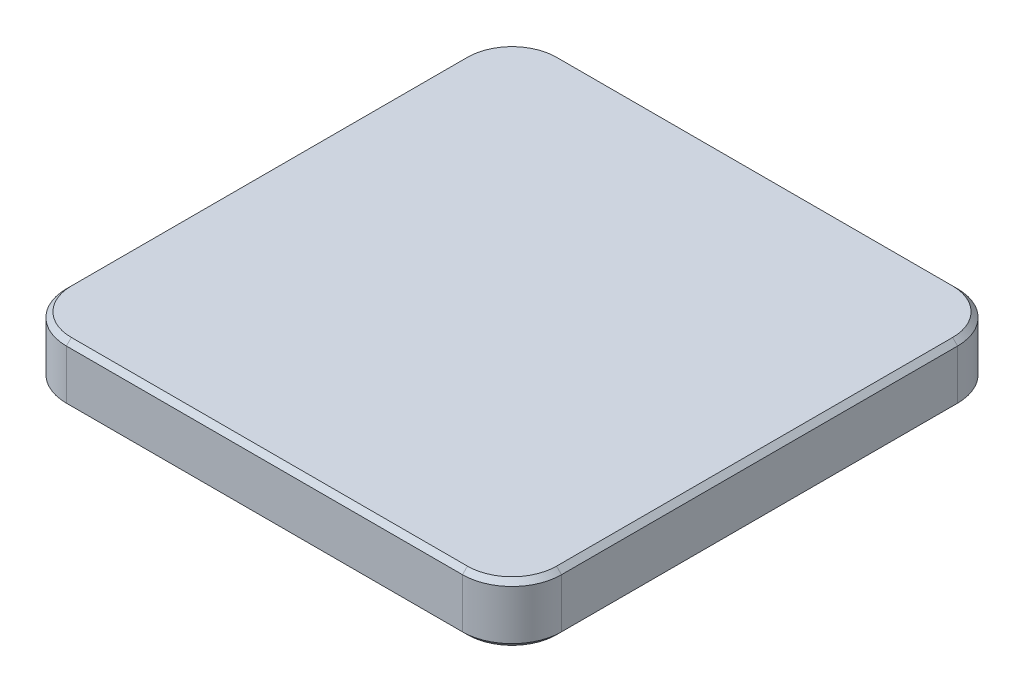
ISO-10303-21;
HEADER;
FILE_DESCRIPTION(('STEP AP214'),'2;1');
FILE_NAME('part.step','',(''),(''),'','','');
FILE_SCHEMA(('AUTOMOTIVE_DESIGN { 1 0 10303 214 1 1 1 1 }'));
ENDSEC;
DATA;
#1=APPLICATION_CONTEXT('core data for automotive mechanical design processes');
#2=APPLICATION_PROTOCOL_DEFINITION('international standard','automotive_design',2000,#1);
#3=PRODUCT_CONTEXT('',#1,'mechanical');
#4=PRODUCT('Part','Part','',(#3));
#5=PRODUCT_RELATED_PRODUCT_CATEGORY('part','',(#4));
#6=PRODUCT_DEFINITION_FORMATION('','',#4);
#7=PRODUCT_DEFINITION_CONTEXT('part definition',#1,'design');
#8=PRODUCT_DEFINITION('design','',#6,#7);
#9=PRODUCT_DEFINITION_SHAPE('','',#8);
#10=(LENGTH_UNIT() NAMED_UNIT(*) SI_UNIT(.MILLI.,.METRE.));
#11=(NAMED_UNIT(*) PLANE_ANGLE_UNIT() SI_UNIT($,.RADIAN.));
#12=(NAMED_UNIT(*) SI_UNIT($,.STERADIAN.) SOLID_ANGLE_UNIT());
#13=UNCERTAINTY_MEASURE_WITH_UNIT(LENGTH_MEASURE(1.E-05),#10,'distance_accuracy_value','');
#14=(GEOMETRIC_REPRESENTATION_CONTEXT(3) GLOBAL_UNCERTAINTY_ASSIGNED_CONTEXT((#13)) GLOBAL_UNIT_ASSIGNED_CONTEXT((#10,
#11,#12)) REPRESENTATION_CONTEXT('',''));
#15=CARTESIAN_POINT('',(0.,0.,0.));
#16=DIRECTION('',(0.,0.,1.));
#17=DIRECTION('',(1.,0.,0.));
#18=AXIS2_PLACEMENT_3D('',#15,#16,#17);
#19=CARTESIAN_POINT('',(-40.,6.,40.));
#20=DIRECTION('',(0.,-1.,0.));
#21=DIRECTION('',(0.,0.,-1.));
#22=AXIS2_PLACEMENT_3D('',#19,#20,#21);
#23=CYLINDRICAL_SURFACE('',#22,10.);
#24=DIRECTION('',(0.,-1.,0.));
#25=VECTOR('',#24,1.);
#26=CARTESIAN_POINT('',(-50.,6.,39.9999999999999));
#27=LINE('',#26,#25);
#28=CARTESIAN_POINT('',(-50.,5.,39.9999999999999));
#29=VERTEX_POINT('',#28);
#30=CARTESIAN_POINT('',(-50.,-5.00000000000003,39.9999999999999));
#31=VERTEX_POINT('',#30);
#32=EDGE_CURVE('E274',#29,#31,#27,.T.);
#33=ORIENTED_EDGE('',*,*,#32,.T.);
#34=CARTESIAN_POINT('',(-40.,-5.00000000000003,40.));
#35=DIRECTION('',(0.,-1.,0.));
#36=DIRECTION('',(0.,0.,-1.));
#37=AXIS2_PLACEMENT_3D('',#34,#35,#36);
#38=CIRCLE('',#37,10.);
#39=CARTESIAN_POINT('',(-39.9999999999999,-5.00000000000003,50.));
#40=VERTEX_POINT('',#39);
#41=EDGE_CURVE('E239',#31,#40,#38,.F.);
#42=ORIENTED_EDGE('',*,*,#41,.T.);
#43=DIRECTION('',(0.,-1.,0.));
#44=VECTOR('',#43,1.);
#45=CARTESIAN_POINT('',(-39.9999999999999,6.,50.));
#46=LINE('',#45,#44);
#47=CARTESIAN_POINT('',(-39.9999999999999,5.,50.));
#48=VERTEX_POINT('',#47);
#49=EDGE_CURVE('E178',#48,#40,#46,.T.);
#50=ORIENTED_EDGE('',*,*,#49,.F.);
#51=CARTESIAN_POINT('',(-40.,5.,40.));
#52=DIRECTION('',(0.,-1.,0.));
#53=DIRECTION('',(0.,0.,-1.));
#54=AXIS2_PLACEMENT_3D('',#51,#52,#53);
#55=CIRCLE('',#54,10.);
#56=EDGE_CURVE('E237',#48,#29,#55,.T.);
#57=ORIENTED_EDGE('',*,*,#56,.T.);
#58=EDGE_LOOP('',(#33,#42,#50,#57));
#59=FACE_BOUND('',#58,.T.);
#60=ADVANCED_FACE('F41',(#59),#23,.T.);
#61=CARTESIAN_POINT('',(-39.9999999999999,6.,50.));
#62=DIRECTION('',(0.,0.,-1.));
#63=DIRECTION('',(-1.,0.,0.));
#64=AXIS2_PLACEMENT_3D('',#61,#62,#63);
#65=PLANE('',#64);
#66=ORIENTED_EDGE('',*,*,#49,.T.);
#67=DIRECTION('',(1.,0.,0.));
#68=VECTOR('',#67,1.);
#69=CARTESIAN_POINT('',(39.9999999999999,-5.00000000000003,50.));
#70=LINE('',#69,#68);
#71=CARTESIAN_POINT('',(39.9999999999999,-5.00000000000003,50.));
#72=VERTEX_POINT('',#71);
#73=EDGE_CURVE('E177',#40,#72,#70,.T.);
#74=ORIENTED_EDGE('',*,*,#73,.T.);
#75=DIRECTION('',(0.,-1.,0.));
#76=VECTOR('',#75,1.);
#77=CARTESIAN_POINT('',(39.9999999999999,6.,50.));
#78=LINE('',#77,#76);
#79=CARTESIAN_POINT('',(39.9999999999999,5.,50.));
#80=VERTEX_POINT('',#79);
#81=EDGE_CURVE('E159',#80,#72,#78,.T.);
#82=ORIENTED_EDGE('',*,*,#81,.F.);
#83=DIRECTION('',(-1.,0.,0.));
#84=VECTOR('',#83,1.);
#85=CARTESIAN_POINT('',(-39.9999999999999,5.,50.));
#86=LINE('',#85,#84);
#87=EDGE_CURVE('E174',#80,#48,#86,.T.);
#88=ORIENTED_EDGE('',*,*,#87,.T.);
#89=EDGE_LOOP('',(#66,#74,#82,#88));
#90=FACE_BOUND('',#89,.T.);
#91=ADVANCED_FACE('F172',(#90),#65,.F.);
#92=CARTESIAN_POINT('',(40.,6.,40.));
#93=DIRECTION('',(0.,-1.,0.));
#94=DIRECTION('',(0.,0.,-1.));
#95=AXIS2_PLACEMENT_3D('',#92,#93,#94);
#96=CYLINDRICAL_SURFACE('',#95,10.);
#97=ORIENTED_EDGE('',*,*,#81,.T.);
#98=CARTESIAN_POINT('',(40.,-5.00000000000003,40.));
#99=DIRECTION('',(0.,-1.,0.));
#100=DIRECTION('',(0.,0.,-1.));
#101=AXIS2_PLACEMENT_3D('',#98,#99,#100);
#102=CIRCLE('',#101,10.);
#103=CARTESIAN_POINT('',(50.,-5.00000000000003,39.9999999999999));
#104=VERTEX_POINT('',#103);
#105=EDGE_CURVE('E166',#72,#104,#102,.F.);
#106=ORIENTED_EDGE('',*,*,#105,.T.);
#107=DIRECTION('',(0.,-1.,0.));
#108=VECTOR('',#107,1.);
#109=CARTESIAN_POINT('',(50.,6.,39.9999999999999));
#110=LINE('',#109,#108);
#111=CARTESIAN_POINT('',(50.,5.,39.9999999999999));
#112=VERTEX_POINT('',#111);
#113=EDGE_CURVE('E161',#112,#104,#110,.T.);
#114=ORIENTED_EDGE('',*,*,#113,.F.);
#115=CARTESIAN_POINT('',(40.,5.,40.));
#116=DIRECTION('',(0.,-1.,0.));
#117=DIRECTION('',(0.,0.,-1.));
#118=AXIS2_PLACEMENT_3D('',#115,#116,#117);
#119=CIRCLE('',#118,10.);
#120=EDGE_CURVE('E156',#112,#80,#119,.T.);
#121=ORIENTED_EDGE('',*,*,#120,.T.);
#122=EDGE_LOOP('',(#97,#106,#114,#121));
#123=FACE_BOUND('',#122,.T.);
#124=ADVANCED_FACE('F158',(#123),#96,.T.);
#125=CARTESIAN_POINT('',(50.,6.,39.9999999999999));
#126=DIRECTION('',(-1.,0.,0.));
#127=DIRECTION('',(0.,0.,1.));
#128=AXIS2_PLACEMENT_3D('',#125,#126,#127);
#129=PLANE('',#128);
#130=ORIENTED_EDGE('',*,*,#113,.T.);
#131=DIRECTION('',(0.,0.,-1.));
#132=VECTOR('',#131,1.);
#133=CARTESIAN_POINT('',(50.,-5.00000000000003,-39.9999999999999));
#134=LINE('',#133,#132);
#135=CARTESIAN_POINT('',(50.,-5.00000000000003,-39.9999999999999));
#136=VERTEX_POINT('',#135);
#137=EDGE_CURVE('E218',#104,#136,#134,.T.);
#138=ORIENTED_EDGE('',*,*,#137,.T.);
#139=DIRECTION('',(0.,-1.,0.));
#140=VECTOR('',#139,1.);
#141=CARTESIAN_POINT('',(50.,6.,-39.9999999999999));
#142=LINE('',#141,#140);
#143=CARTESIAN_POINT('',(50.,5.,-39.9999999999999));
#144=VERTEX_POINT('',#143);
#145=EDGE_CURVE('E299',#144,#136,#142,.T.);
#146=ORIENTED_EDGE('',*,*,#145,.F.);
#147=DIRECTION('',(0.,0.,1.));
#148=VECTOR('',#147,1.);
#149=CARTESIAN_POINT('',(50.,5.,39.9999999999999));
#150=LINE('',#149,#148);
#151=EDGE_CURVE('E216',#144,#112,#150,.T.);
#152=ORIENTED_EDGE('',*,*,#151,.T.);
#153=EDGE_LOOP('',(#130,#138,#146,#152));
#154=FACE_BOUND('',#153,.T.);
#155=ADVANCED_FACE('F296',(#154),#129,.F.);
#156=CARTESIAN_POINT('',(40.,6.,-40.));
#157=DIRECTION('',(0.,-1.,0.));
#158=DIRECTION('',(0.,0.,-1.));
#159=AXIS2_PLACEMENT_3D('',#156,#157,#158);
#160=CYLINDRICAL_SURFACE('',#159,10.);
#161=ORIENTED_EDGE('',*,*,#145,.T.);
#162=CARTESIAN_POINT('',(40.,-5.00000000000003,-40.));
#163=DIRECTION('',(0.,-1.,0.));
#164=DIRECTION('',(0.,0.,-1.));
#165=AXIS2_PLACEMENT_3D('',#162,#163,#164);
#166=CIRCLE('',#165,10.);
#167=CARTESIAN_POINT('',(39.9999999999999,-5.00000000000003,-50.));
#168=VERTEX_POINT('',#167);
#169=EDGE_CURVE('E222',#136,#168,#166,.F.);
#170=ORIENTED_EDGE('',*,*,#169,.T.);
#171=DIRECTION('',(0.,-1.,0.));
#172=VECTOR('',#171,1.);
#173=CARTESIAN_POINT('',(39.9999999999999,6.,-50.));
#174=LINE('',#173,#172);
#175=CARTESIAN_POINT('',(39.9999999999999,5.,-50.));
#176=VERTEX_POINT('',#175);
#177=EDGE_CURVE('E302',#176,#168,#174,.T.);
#178=ORIENTED_EDGE('',*,*,#177,.F.);
#179=CARTESIAN_POINT('',(40.,5.,-40.));
#180=DIRECTION('',(0.,-1.,0.));
#181=DIRECTION('',(0.,0.,-1.));
#182=AXIS2_PLACEMENT_3D('',#179,#180,#181);
#183=CIRCLE('',#182,10.);
#184=EDGE_CURVE('E220',#176,#144,#183,.T.);
#185=ORIENTED_EDGE('',*,*,#184,.T.);
#186=EDGE_LOOP('',(#161,#170,#178,#185));
#187=FACE_BOUND('',#186,.T.);
#188=ADVANCED_FACE('F347',(#187),#160,.T.);
#189=CARTESIAN_POINT('',(-39.9999999999999,6.,-50.));
#190=DIRECTION('',(0.,0.,1.));
#191=DIRECTION('',(1.,0.,0.));
#192=AXIS2_PLACEMENT_3D('',#189,#190,#191);
#193=PLANE('',#192);
#194=ORIENTED_EDGE('',*,*,#177,.T.);
#195=DIRECTION('',(-1.,0.,0.));
#196=VECTOR('',#195,1.);
#197=CARTESIAN_POINT('',(-39.9999999999999,-5.00000000000003,-50.));
#198=LINE('',#197,#196);
#199=CARTESIAN_POINT('',(-39.9999999999999,-5.00000000000003,-50.));
#200=VERTEX_POINT('',#199);
#201=EDGE_CURVE('E226',#168,#200,#198,.T.);
#202=ORIENTED_EDGE('',*,*,#201,.T.);
#203=DIRECTION('',(0.,-1.,0.));
#204=VECTOR('',#203,1.);
#205=CARTESIAN_POINT('',(-39.9999999999999,6.,-50.));
#206=LINE('',#205,#204);
#207=CARTESIAN_POINT('',(-39.9999999999999,5.,-50.));
#208=VERTEX_POINT('',#207);
#209=EDGE_CURVE('E306',#208,#200,#206,.T.);
#210=ORIENTED_EDGE('',*,*,#209,.F.);
#211=DIRECTION('',(1.,0.,0.));
#212=VECTOR('',#211,1.);
#213=CARTESIAN_POINT('',(-39.9999999999999,5.,-50.));
#214=LINE('',#213,#212);
#215=EDGE_CURVE('E224',#208,#176,#214,.T.);
#216=ORIENTED_EDGE('',*,*,#215,.T.);
#217=EDGE_LOOP('',(#194,#202,#210,#216));
#218=FACE_BOUND('',#217,.T.);
#219=ADVANCED_FACE('F350',(#218),#193,.F.);
#220=CARTESIAN_POINT('',(-40.,6.,-40.));
#221=DIRECTION('',(0.,-1.,0.));
#222=DIRECTION('',(0.,0.,-1.));
#223=AXIS2_PLACEMENT_3D('',#220,#221,#222);
#224=CYLINDRICAL_SURFACE('',#223,10.);
#225=ORIENTED_EDGE('',*,*,#209,.T.);
#226=CARTESIAN_POINT('',(-40.,-5.00000000000003,-40.));
#227=DIRECTION('',(0.,-1.,0.));
#228=DIRECTION('',(0.,0.,-1.));
#229=AXIS2_PLACEMENT_3D('',#226,#227,#228);
#230=CIRCLE('',#229,10.);
#231=CARTESIAN_POINT('',(-50.,-5.00000000000003,-39.9999999999999));
#232=VERTEX_POINT('',#231);
#233=EDGE_CURVE('E230',#200,#232,#230,.F.);
#234=ORIENTED_EDGE('',*,*,#233,.T.);
#235=DIRECTION('',(0.,-1.,0.));
#236=VECTOR('',#235,1.);
#237=CARTESIAN_POINT('',(-50.,6.,-39.9999999999999));
#238=LINE('',#237,#236);
#239=CARTESIAN_POINT('',(-50.,5.,-39.9999999999999));
#240=VERTEX_POINT('',#239);
#241=EDGE_CURVE('E311',#240,#232,#238,.T.);
#242=ORIENTED_EDGE('',*,*,#241,.F.);
#243=CARTESIAN_POINT('',(-40.,5.,-40.));
#244=DIRECTION('',(0.,-1.,0.));
#245=DIRECTION('',(0.,0.,-1.));
#246=AXIS2_PLACEMENT_3D('',#243,#244,#245);
#247=CIRCLE('',#246,10.);
#248=EDGE_CURVE('E228',#240,#208,#247,.T.);
#249=ORIENTED_EDGE('',*,*,#248,.T.);
#250=EDGE_LOOP('',(#225,#234,#242,#249));
#251=FACE_BOUND('',#250,.T.);
#252=ADVANCED_FACE('F364',(#251),#224,.T.);
#253=CARTESIAN_POINT('',(-50.,6.,39.9999999999999));
#254=DIRECTION('',(1.,0.,0.));
#255=DIRECTION('',(0.,0.,-1.));
#256=AXIS2_PLACEMENT_3D('',#253,#254,#255);
#257=PLANE('',#256);
#258=ORIENTED_EDGE('',*,*,#241,.T.);
#259=DIRECTION('',(0.,0.,1.));
#260=VECTOR('',#259,1.);
#261=CARTESIAN_POINT('',(-50.,-5.00000000000003,39.9999999999999));
#262=LINE('',#261,#260);
#263=EDGE_CURVE('E235',#232,#31,#262,.T.);
#264=ORIENTED_EDGE('',*,*,#263,.T.);
#265=ORIENTED_EDGE('',*,*,#32,.F.);
#266=DIRECTION('',(0.,0.,-1.));
#267=VECTOR('',#266,1.);
#268=CARTESIAN_POINT('',(-50.,5.,39.9999999999999));
#269=LINE('',#268,#267);
#270=EDGE_CURVE('E232',#29,#240,#269,.T.);
#271=ORIENTED_EDGE('',*,*,#270,.T.);
#272=EDGE_LOOP('',(#258,#264,#265,#271));
#273=FACE_BOUND('',#272,.T.);
#274=ADVANCED_FACE('F365',(#273),#257,.F.);
#275=CARTESIAN_POINT('',(-40.,6.,40.));
#276=DIRECTION('',(0.,-1.,0.));
#277=DIRECTION('',(0.,0.,-1.));
#278=AXIS2_PLACEMENT_3D('',#275,#276,#277);
#279=PLANE('',#278);
#280=CARTESIAN_POINT('',(-40.,6.,-40.));
#281=DIRECTION('',(0.,-1.,0.));
#282=DIRECTION('',(0.,0.,-1.));
#283=AXIS2_PLACEMENT_3D('',#280,#281,#282);
#284=CIRCLE('',#283,9.00000000000001);
#285=CARTESIAN_POINT('',(-39.9999999999999,6.,-49.));
#286=VERTEX_POINT('',#285);
#287=CARTESIAN_POINT('',(-49.,6.,-39.9999999999999));
#288=VERTEX_POINT('',#287);
#289=EDGE_CURVE('E51',#286,#288,#284,.F.);
#290=ORIENTED_EDGE('',*,*,#289,.T.);
#291=DIRECTION('',(0.,0.,1.));
#292=VECTOR('',#291,1.);
#293=CARTESIAN_POINT('',(-49.,6.,40.));
#294=LINE('',#293,#292);
#295=CARTESIAN_POINT('',(-49.,6.,39.9999999999999));
#296=VERTEX_POINT('',#295);
#297=EDGE_CURVE('E11',#288,#296,#294,.T.);
#298=ORIENTED_EDGE('',*,*,#297,.T.);
#299=CARTESIAN_POINT('',(-40.,6.,40.));
#300=DIRECTION('',(0.,-1.,0.));
#301=DIRECTION('',(0.,0.,-1.));
#302=AXIS2_PLACEMENT_3D('',#299,#300,#301);
#303=CIRCLE('',#302,9.00000000000001);
#304=CARTESIAN_POINT('',(-39.9999999999999,6.,49.));
#305=VERTEX_POINT('',#304);
#306=EDGE_CURVE('E241',#296,#305,#303,.F.);
#307=ORIENTED_EDGE('',*,*,#306,.T.);
#308=DIRECTION('',(1.,0.,0.));
#309=VECTOR('',#308,1.);
#310=CARTESIAN_POINT('',(-40.,6.,49.));
#311=LINE('',#310,#309);
#312=CARTESIAN_POINT('',(39.9999999999999,6.,49.));
#313=VERTEX_POINT('',#312);
#314=EDGE_CURVE('E243',#305,#313,#311,.T.);
#315=ORIENTED_EDGE('',*,*,#314,.T.);
#316=CARTESIAN_POINT('',(40.,6.,40.));
#317=DIRECTION('',(0.,-1.,0.));
#318=DIRECTION('',(0.,0.,-1.));
#319=AXIS2_PLACEMENT_3D('',#316,#317,#318);
#320=CIRCLE('',#319,9.00000000000001);
#321=CARTESIAN_POINT('',(49.,6.,39.9999999999999));
#322=VERTEX_POINT('',#321);
#323=EDGE_CURVE('E184',#313,#322,#320,.F.);
#324=ORIENTED_EDGE('',*,*,#323,.T.);
#325=DIRECTION('',(0.,0.,-1.));
#326=VECTOR('',#325,1.);
#327=CARTESIAN_POINT('',(49.,6.,40.));
#328=LINE('',#327,#326);
#329=CARTESIAN_POINT('',(49.,6.,-39.9999999999999));
#330=VERTEX_POINT('',#329);
#331=EDGE_CURVE('E246',#322,#330,#328,.T.);
#332=ORIENTED_EDGE('',*,*,#331,.T.);
#333=CARTESIAN_POINT('',(40.,6.,-40.));
#334=DIRECTION('',(0.,-1.,0.));
#335=DIRECTION('',(0.,0.,-1.));
#336=AXIS2_PLACEMENT_3D('',#333,#334,#335);
#337=CIRCLE('',#336,9.00000000000001);
#338=CARTESIAN_POINT('',(39.9999999999999,6.,-49.));
#339=VERTEX_POINT('',#338);
#340=EDGE_CURVE('E248',#330,#339,#337,.F.);
#341=ORIENTED_EDGE('',*,*,#340,.T.);
#342=DIRECTION('',(-1.,0.,0.));
#343=VECTOR('',#342,1.);
#344=CARTESIAN_POINT('',(-40.,6.,-49.));
#345=LINE('',#344,#343);
#346=EDGE_CURVE('E62',#339,#286,#345,.T.);
#347=ORIENTED_EDGE('',*,*,#346,.T.);
#348=EDGE_LOOP('',(#290,#298,#307,#315,#324,#332,#341,#347));
#349=FACE_BOUND('',#348,.T.);
#350=ADVANCED_FACE('F374',(#349),#279,.F.);
#351=CARTESIAN_POINT('',(-40.,-6.,40.));
#352=DIRECTION('',(0.,-1.,0.));
#353=DIRECTION('',(0.,0.,-1.));
#354=AXIS2_PLACEMENT_3D('',#351,#352,#353);
#355=PLANE('',#354);
#356=CARTESIAN_POINT('',(40.,-6.,40.));
#357=DIRECTION('',(0.,-1.,0.));
#358=DIRECTION('',(0.,0.,-1.));
#359=AXIS2_PLACEMENT_3D('',#356,#357,#358);
#360=CIRCLE('',#359,9.00000000000002);
#361=CARTESIAN_POINT('',(49.,-6.,39.9999999999999));
#362=VERTEX_POINT('',#361);
#363=CARTESIAN_POINT('',(39.9999999999999,-6.,49.));
#364=VERTEX_POINT('',#363);
#365=EDGE_CURVE('E211',#362,#364,#360,.T.);
#366=ORIENTED_EDGE('',*,*,#365,.T.);
#367=DIRECTION('',(-1.,0.,0.));
#368=VECTOR('',#367,1.);
#369=CARTESIAN_POINT('',(-39.9999999999999,-6.,49.));
#370=LINE('',#369,#368);
#371=CARTESIAN_POINT('',(-39.9999999999999,-6.,49.));
#372=VERTEX_POINT('',#371);
#373=EDGE_CURVE('E167',#364,#372,#370,.T.);
#374=ORIENTED_EDGE('',*,*,#373,.T.);
#375=CARTESIAN_POINT('',(-40.,-6.,40.));
#376=DIRECTION('',(0.,-1.,0.));
#377=DIRECTION('',(0.,0.,-1.));
#378=AXIS2_PLACEMENT_3D('',#375,#376,#377);
#379=CIRCLE('',#378,9.00000000000002);
#380=CARTESIAN_POINT('',(-49.,-6.,39.9999999999999));
#381=VERTEX_POINT('',#380);
#382=EDGE_CURVE('E196',#372,#381,#379,.T.);
#383=ORIENTED_EDGE('',*,*,#382,.T.);
#384=DIRECTION('',(0.,0.,-1.));
#385=VECTOR('',#384,1.);
#386=CARTESIAN_POINT('',(-49.,-6.,-39.9999999999999));
#387=LINE('',#386,#385);
#388=CARTESIAN_POINT('',(-49.,-6.,-39.9999999999999));
#389=VERTEX_POINT('',#388);
#390=EDGE_CURVE('E201',#381,#389,#387,.T.);
#391=ORIENTED_EDGE('',*,*,#390,.T.);
#392=CARTESIAN_POINT('',(-40.,-6.,-40.));
#393=DIRECTION('',(0.,-1.,0.));
#394=DIRECTION('',(0.,0.,-1.));
#395=AXIS2_PLACEMENT_3D('',#392,#393,#394);
#396=CIRCLE('',#395,9.00000000000002);
#397=CARTESIAN_POINT('',(-39.9999999999999,-6.,-49.));
#398=VERTEX_POINT('',#397);
#399=EDGE_CURVE('E203',#389,#398,#396,.T.);
#400=ORIENTED_EDGE('',*,*,#399,.T.);
#401=DIRECTION('',(1.,0.,0.));
#402=VECTOR('',#401,1.);
#403=CARTESIAN_POINT('',(39.9999999999999,-6.,-49.));
#404=LINE('',#403,#402);
#405=CARTESIAN_POINT('',(39.9999999999999,-6.,-49.));
#406=VERTEX_POINT('',#405);
#407=EDGE_CURVE('E205',#398,#406,#404,.T.);
#408=ORIENTED_EDGE('',*,*,#407,.T.);
#409=CARTESIAN_POINT('',(40.,-6.,-40.));
#410=DIRECTION('',(0.,-1.,0.));
#411=DIRECTION('',(0.,0.,-1.));
#412=AXIS2_PLACEMENT_3D('',#409,#410,#411);
#413=CIRCLE('',#412,9.00000000000002);
#414=CARTESIAN_POINT('',(49.,-6.,-39.9999999999999));
#415=VERTEX_POINT('',#414);
#416=EDGE_CURVE('E207',#406,#415,#413,.T.);
#417=ORIENTED_EDGE('',*,*,#416,.T.);
#418=DIRECTION('',(0.,0.,1.));
#419=VECTOR('',#418,1.);
#420=CARTESIAN_POINT('',(49.,-6.,39.9999999999999));
#421=LINE('',#420,#419);
#422=EDGE_CURVE('E209',#415,#362,#421,.T.);
#423=ORIENTED_EDGE('',*,*,#422,.T.);
#424=EDGE_LOOP('',(#366,#374,#383,#391,#400,#408,#417,#423));
#425=FACE_BOUND('',#424,.T.);
#426=ADVANCED_FACE('F376',(#425),#355,.T.);
#427=CARTESIAN_POINT('',(-39.9999999999999,-5.00000000000003,-50.));
#428=DIRECTION('',(0.,-0.707106781186551,-0.707106781186544));
#429=DIRECTION('',(1.,0.,0.));
#430=AXIS2_PLACEMENT_3D('',#427,#428,#429);
#431=PLANE('',#430);
#432=DIRECTION('',(0.,0.707106781186544,-0.707106781186551));
#433=VECTOR('',#432,1.);
#434=CARTESIAN_POINT('',(39.9999999999999,-6.,-49.));
#435=LINE('',#434,#433);
#436=EDGE_CURVE('E268',#406,#168,#435,.T.);
#437=ORIENTED_EDGE('',*,*,#436,.F.);
#438=ORIENTED_EDGE('',*,*,#407,.F.);
#439=DIRECTION('',(0.,-0.707106781186544,0.707106781186551));
#440=VECTOR('',#439,1.);
#441=CARTESIAN_POINT('',(-39.9999999999999,-5.00000000000003,-50.));
#442=LINE('',#441,#440);
#443=EDGE_CURVE('E271',#200,#398,#442,.T.);
#444=ORIENTED_EDGE('',*,*,#443,.F.);
#445=ORIENTED_EDGE('',*,*,#201,.F.);
#446=EDGE_LOOP('',(#437,#438,#444,#445));
#447=FACE_BOUND('',#446,.T.);
#448=ADVANCED_FACE('F355',(#447),#431,.T.);
#449=CARTESIAN_POINT('',(-40.,-5.00000000000003,-40.));
#450=DIRECTION('',(0.,1.,0.));
#451=DIRECTION('',(0.,0.,1.));
#452=AXIS2_PLACEMENT_3D('',#449,#450,#451);
#453=CONICAL_SURFACE('',#452,10.,0.785398163397453);
#454=ORIENTED_EDGE('',*,*,#443,.T.);
#455=ORIENTED_EDGE('',*,*,#399,.F.);
#456=DIRECTION('',(0.707106781186551,-0.707106781186544,0.));
#457=VECTOR('',#456,1.);
#458=CARTESIAN_POINT('',(-50.,-5.00000000000003,-39.9999999999999));
#459=LINE('',#458,#457);
#460=EDGE_CURVE('E265',#232,#389,#459,.T.);
#461=ORIENTED_EDGE('',*,*,#460,.F.);
#462=ORIENTED_EDGE('',*,*,#233,.F.);
#463=EDGE_LOOP('',(#454,#455,#461,#462));
#464=FACE_BOUND('',#463,.T.);
#465=ADVANCED_FACE('F361',(#464),#453,.T.);
#466=CARTESIAN_POINT('',(40.,-5.00000000000003,-40.));
#467=DIRECTION('',(0.,1.,0.));
#468=DIRECTION('',(0.,0.,1.));
#469=AXIS2_PLACEMENT_3D('',#466,#467,#468);
#470=CONICAL_SURFACE('',#469,10.,0.785398163397453);
#471=ORIENTED_EDGE('',*,*,#436,.T.);
#472=ORIENTED_EDGE('',*,*,#169,.F.);
#473=DIRECTION('',(0.707106781186551,0.707106781186544,0.));
#474=VECTOR('',#473,1.);
#475=CARTESIAN_POINT('',(49.,-6.,-39.9999999999999));
#476=LINE('',#475,#474);
#477=EDGE_CURVE('E262',#415,#136,#476,.T.);
#478=ORIENTED_EDGE('',*,*,#477,.F.);
#479=ORIENTED_EDGE('',*,*,#416,.F.);
#480=EDGE_LOOP('',(#471,#472,#478,#479));
#481=FACE_BOUND('',#480,.T.);
#482=ADVANCED_FACE('F344',(#481),#470,.T.);
#483=CARTESIAN_POINT('',(-50.,-5.00000000000003,39.9999999999999));
#484=DIRECTION('',(-0.707106781186544,-0.707106781186551,0.));
#485=DIRECTION('',(0.,0.,-1.));
#486=AXIS2_PLACEMENT_3D('',#483,#484,#485);
#487=PLANE('',#486);
#488=ORIENTED_EDGE('',*,*,#460,.T.);
#489=ORIENTED_EDGE('',*,*,#390,.F.);
#490=DIRECTION('',(0.707106781186551,-0.707106781186544,0.));
#491=VECTOR('',#490,1.);
#492=CARTESIAN_POINT('',(-50.,-5.00000000000003,39.9999999999999));
#493=LINE('',#492,#491);
#494=EDGE_CURVE('E259',#31,#381,#493,.T.);
#495=ORIENTED_EDGE('',*,*,#494,.F.);
#496=ORIENTED_EDGE('',*,*,#263,.F.);
#497=EDGE_LOOP('',(#488,#489,#495,#496));
#498=FACE_BOUND('',#497,.T.);
#499=ADVANCED_FACE('F324',(#498),#487,.T.);
#500=CARTESIAN_POINT('',(50.,-5.00000000000003,39.9999999999999));
#501=DIRECTION('',(0.707106781186544,-0.707106781186551,0.));
#502=DIRECTION('',(0.,0.,1.));
#503=AXIS2_PLACEMENT_3D('',#500,#501,#502);
#504=PLANE('',#503);
#505=ORIENTED_EDGE('',*,*,#477,.T.);
#506=ORIENTED_EDGE('',*,*,#137,.F.);
#507=DIRECTION('',(0.707106781186551,0.707106781186544,0.));
#508=VECTOR('',#507,1.);
#509=CARTESIAN_POINT('',(49.,-6.,39.9999999999999));
#510=LINE('',#509,#508);
#511=EDGE_CURVE('E256',#362,#104,#510,.T.);
#512=ORIENTED_EDGE('',*,*,#511,.F.);
#513=ORIENTED_EDGE('',*,*,#422,.F.);
#514=EDGE_LOOP('',(#505,#506,#512,#513));
#515=FACE_BOUND('',#514,.T.);
#516=ADVANCED_FACE('F340',(#515),#504,.T.);
#517=CARTESIAN_POINT('',(-40.,-5.00000000000003,40.));
#518=DIRECTION('',(0.,1.,0.));
#519=DIRECTION('',(0.,0.,1.));
#520=AXIS2_PLACEMENT_3D('',#517,#518,#519);
#521=CONICAL_SURFACE('',#520,10.,0.785398163397453);
#522=ORIENTED_EDGE('',*,*,#494,.T.);
#523=ORIENTED_EDGE('',*,*,#382,.F.);
#524=DIRECTION('',(0.,-0.707106781186544,-0.707106781186551));
#525=VECTOR('',#524,1.);
#526=CARTESIAN_POINT('',(-39.9999999999999,-5.00000000000003,50.));
#527=LINE('',#526,#525);
#528=EDGE_CURVE('E254',#40,#372,#527,.T.);
#529=ORIENTED_EDGE('',*,*,#528,.F.);
#530=ORIENTED_EDGE('',*,*,#41,.F.);
#531=EDGE_LOOP('',(#522,#523,#529,#530));
#532=FACE_BOUND('',#531,.T.);
#533=ADVANCED_FACE('F328',(#532),#521,.T.);
#534=CARTESIAN_POINT('',(40.,-5.00000000000003,40.));
#535=DIRECTION('',(0.,1.,0.));
#536=DIRECTION('',(0.,0.,1.));
#537=AXIS2_PLACEMENT_3D('',#534,#535,#536);
#538=CONICAL_SURFACE('',#537,10.,0.785398163397453);
#539=ORIENTED_EDGE('',*,*,#511,.T.);
#540=ORIENTED_EDGE('',*,*,#105,.F.);
#541=DIRECTION('',(0.,0.707106781186544,0.707106781186551));
#542=VECTOR('',#541,1.);
#543=CARTESIAN_POINT('',(39.9999999999999,-6.,49.));
#544=LINE('',#543,#542);
#545=EDGE_CURVE('E252',#364,#72,#544,.T.);
#546=ORIENTED_EDGE('',*,*,#545,.F.);
#547=ORIENTED_EDGE('',*,*,#365,.F.);
#548=EDGE_LOOP('',(#539,#540,#546,#547));
#549=FACE_BOUND('',#548,.T.);
#550=ADVANCED_FACE('F336',(#549),#538,.T.);
#551=CARTESIAN_POINT('',(-39.9999999999999,-5.00000000000003,50.));
#552=DIRECTION('',(0.,-0.707106781186551,0.707106781186544));
#553=DIRECTION('',(-1.,0.,0.));
#554=AXIS2_PLACEMENT_3D('',#551,#552,#553);
#555=PLANE('',#554);
#556=ORIENTED_EDGE('',*,*,#528,.T.);
#557=ORIENTED_EDGE('',*,*,#373,.F.);
#558=ORIENTED_EDGE('',*,*,#545,.T.);
#559=ORIENTED_EDGE('',*,*,#73,.F.);
#560=EDGE_LOOP('',(#556,#557,#558,#559));
#561=FACE_BOUND('',#560,.T.);
#562=ADVANCED_FACE('F331',(#561),#555,.T.);
#563=CARTESIAN_POINT('',(49.,6.,40.));
#564=DIRECTION('',(-0.70710678118655,-0.707106781186545,0.));
#565=DIRECTION('',(0.,0.,-1.));
#566=AXIS2_PLACEMENT_3D('',#563,#564,#565);
#567=PLANE('',#566);
#568=DIRECTION('',(-0.707106781186545,0.70710678118655,0.));
#569=VECTOR('',#568,1.);
#570=CARTESIAN_POINT('',(50.,5.,39.9999999999999));
#571=LINE('',#570,#569);
#572=EDGE_CURVE('E283',#112,#322,#571,.T.);
#573=ORIENTED_EDGE('',*,*,#572,.F.);
#574=ORIENTED_EDGE('',*,*,#151,.F.);
#575=DIRECTION('',(0.707106781186545,-0.70710678118655,0.));
#576=VECTOR('',#575,1.);
#577=CARTESIAN_POINT('',(49.,6.,-39.9999999999999));
#578=LINE('',#577,#576);
#579=EDGE_CURVE('E46',#330,#144,#578,.T.);
#580=ORIENTED_EDGE('',*,*,#579,.F.);
#581=ORIENTED_EDGE('',*,*,#331,.F.);
#582=EDGE_LOOP('',(#573,#574,#580,#581));
#583=FACE_BOUND('',#582,.T.);
#584=ADVANCED_FACE('F44',(#583),#567,.F.);
#585=CARTESIAN_POINT('',(40.,6.,-40.));
#586=DIRECTION('',(0.,-1.,0.));
#587=DIRECTION('',(0.,0.,-1.));
#588=AXIS2_PLACEMENT_3D('',#585,#586,#587);
#589=CONICAL_SURFACE('',#588,9.00000000000001,0.785398163397445);
#590=ORIENTED_EDGE('',*,*,#579,.T.);
#591=ORIENTED_EDGE('',*,*,#184,.F.);
#592=DIRECTION('',(0.,-0.70710678118655,-0.707106781186545));
#593=VECTOR('',#592,1.);
#594=CARTESIAN_POINT('',(39.9999999999999,6.,-49.));
#595=LINE('',#594,#593);
#596=EDGE_CURVE('E187',#339,#176,#595,.T.);
#597=ORIENTED_EDGE('',*,*,#596,.F.);
#598=ORIENTED_EDGE('',*,*,#340,.F.);
#599=EDGE_LOOP('',(#590,#591,#597,#598));
#600=FACE_BOUND('',#599,.T.);
#601=ADVANCED_FACE('F289',(#600),#589,.T.);
#602=CARTESIAN_POINT('',(40.,6.,40.));
#603=DIRECTION('',(0.,-1.,0.));
#604=DIRECTION('',(0.,0.,-1.));
#605=AXIS2_PLACEMENT_3D('',#602,#603,#604);
#606=CONICAL_SURFACE('',#605,9.00000000000001,0.785398163397445);
#607=ORIENTED_EDGE('',*,*,#572,.T.);
#608=ORIENTED_EDGE('',*,*,#323,.F.);
#609=DIRECTION('',(0.,0.70710678118655,-0.707106781186545));
#610=VECTOR('',#609,1.);
#611=CARTESIAN_POINT('',(39.9999999999999,5.,50.));
#612=LINE('',#611,#610);
#613=EDGE_CURVE('E182',#80,#313,#612,.T.);
#614=ORIENTED_EDGE('',*,*,#613,.F.);
#615=ORIENTED_EDGE('',*,*,#120,.F.);
#616=EDGE_LOOP('',(#607,#608,#614,#615));
#617=FACE_BOUND('',#616,.T.);
#618=ADVANCED_FACE('F183',(#617),#606,.T.);
#619=CARTESIAN_POINT('',(-40.,6.,-49.));
#620=DIRECTION('',(0.,-0.707106781186545,0.70710678118655));
#621=DIRECTION('',(-1.,0.,0.));
#622=AXIS2_PLACEMENT_3D('',#619,#620,#621);
#623=PLANE('',#622);
#624=ORIENTED_EDGE('',*,*,#596,.T.);
#625=ORIENTED_EDGE('',*,*,#215,.F.);
#626=DIRECTION('',(0.,-0.70710678118655,-0.707106781186545));
#627=VECTOR('',#626,1.);
#628=CARTESIAN_POINT('',(-39.9999999999999,6.,-49.));
#629=LINE('',#628,#627);
#630=EDGE_CURVE('E188',#286,#208,#629,.T.);
#631=ORIENTED_EDGE('',*,*,#630,.F.);
#632=ORIENTED_EDGE('',*,*,#346,.F.);
#633=EDGE_LOOP('',(#624,#625,#631,#632));
#634=FACE_BOUND('',#633,.T.);
#635=ADVANCED_FACE('F456',(#634),#623,.F.);
#636=CARTESIAN_POINT('',(-40.,6.,49.));
#637=DIRECTION('',(0.,-0.707106781186545,-0.70710678118655));
#638=DIRECTION('',(1.,0.,0.));
#639=AXIS2_PLACEMENT_3D('',#636,#637,#638);
#640=PLANE('',#639);
#641=ORIENTED_EDGE('',*,*,#613,.T.);
#642=ORIENTED_EDGE('',*,*,#314,.F.);
#643=DIRECTION('',(0.,0.70710678118655,-0.707106781186545));
#644=VECTOR('',#643,1.);
#645=CARTESIAN_POINT('',(-39.9999999999999,5.,50.));
#646=LINE('',#645,#644);
#647=EDGE_CURVE('E193',#48,#305,#646,.T.);
#648=ORIENTED_EDGE('',*,*,#647,.F.);
#649=ORIENTED_EDGE('',*,*,#87,.F.);
#650=EDGE_LOOP('',(#641,#642,#648,#649));
#651=FACE_BOUND('',#650,.T.);
#652=ADVANCED_FACE('F191',(#651),#640,.F.);
#653=CARTESIAN_POINT('',(-40.,6.,-40.));
#654=DIRECTION('',(0.,-1.,0.));
#655=DIRECTION('',(0.,0.,-1.));
#656=AXIS2_PLACEMENT_3D('',#653,#654,#655);
#657=CONICAL_SURFACE('',#656,9.00000000000001,0.785398163397445);
#658=ORIENTED_EDGE('',*,*,#630,.T.);
#659=ORIENTED_EDGE('',*,*,#248,.F.);
#660=DIRECTION('',(-0.707106781186545,-0.70710678118655,0.));
#661=VECTOR('',#660,1.);
#662=CARTESIAN_POINT('',(-49.,6.,-39.9999999999999));
#663=LINE('',#662,#661);
#664=EDGE_CURVE('E277',#288,#240,#663,.T.);
#665=ORIENTED_EDGE('',*,*,#664,.F.);
#666=ORIENTED_EDGE('',*,*,#289,.F.);
#667=EDGE_LOOP('',(#658,#659,#665,#666));
#668=FACE_BOUND('',#667,.T.);
#669=ADVANCED_FACE('F444',(#668),#657,.T.);
#670=CARTESIAN_POINT('',(-40.,6.,40.));
#671=DIRECTION('',(0.,-1.,0.));
#672=DIRECTION('',(0.,0.,-1.));
#673=AXIS2_PLACEMENT_3D('',#670,#671,#672);
#674=CONICAL_SURFACE('',#673,9.00000000000001,0.785398163397445);
#675=ORIENTED_EDGE('',*,*,#647,.T.);
#676=ORIENTED_EDGE('',*,*,#306,.F.);
#677=DIRECTION('',(0.707106781186545,0.70710678118655,0.));
#678=VECTOR('',#677,1.);
#679=CARTESIAN_POINT('',(-50.,5.,39.9999999999999));
#680=LINE('',#679,#678);
#681=EDGE_CURVE('E275',#29,#296,#680,.T.);
#682=ORIENTED_EDGE('',*,*,#681,.F.);
#683=ORIENTED_EDGE('',*,*,#56,.F.);
#684=EDGE_LOOP('',(#675,#676,#682,#683));
#685=FACE_BOUND('',#684,.T.);
#686=ADVANCED_FACE('F373',(#685),#674,.T.);
#687=CARTESIAN_POINT('',(-49.,6.,40.));
#688=DIRECTION('',(0.70710678118655,-0.707106781186545,0.));
#689=DIRECTION('',(0.,0.,1.));
#690=AXIS2_PLACEMENT_3D('',#687,#688,#689);
#691=PLANE('',#690);
#692=ORIENTED_EDGE('',*,*,#664,.T.);
#693=ORIENTED_EDGE('',*,*,#270,.F.);
#694=ORIENTED_EDGE('',*,*,#681,.T.);
#695=ORIENTED_EDGE('',*,*,#297,.F.);
#696=EDGE_LOOP('',(#692,#693,#694,#695));
#697=FACE_BOUND('',#696,.T.);
#698=ADVANCED_FACE('F368',(#697),#691,.F.);
#699=CLOSED_SHELL('',(#60,#91,#124,#155,#188,#219,#252,#274,#350,#426,#448,#465,#482,#499,#516,
#533,#550,#562,#584,#601,#618,#635,#652,#669,#686,#698));
#700=MANIFOLD_SOLID_BREP('B2',#699);
#701=ADVANCED_BREP_SHAPE_REPRESENTATION('',(#18,#700),#14);
#702=SHAPE_DEFINITION_REPRESENTATION(#9,#701);
ENDSEC;
END-ISO-10303-21;
